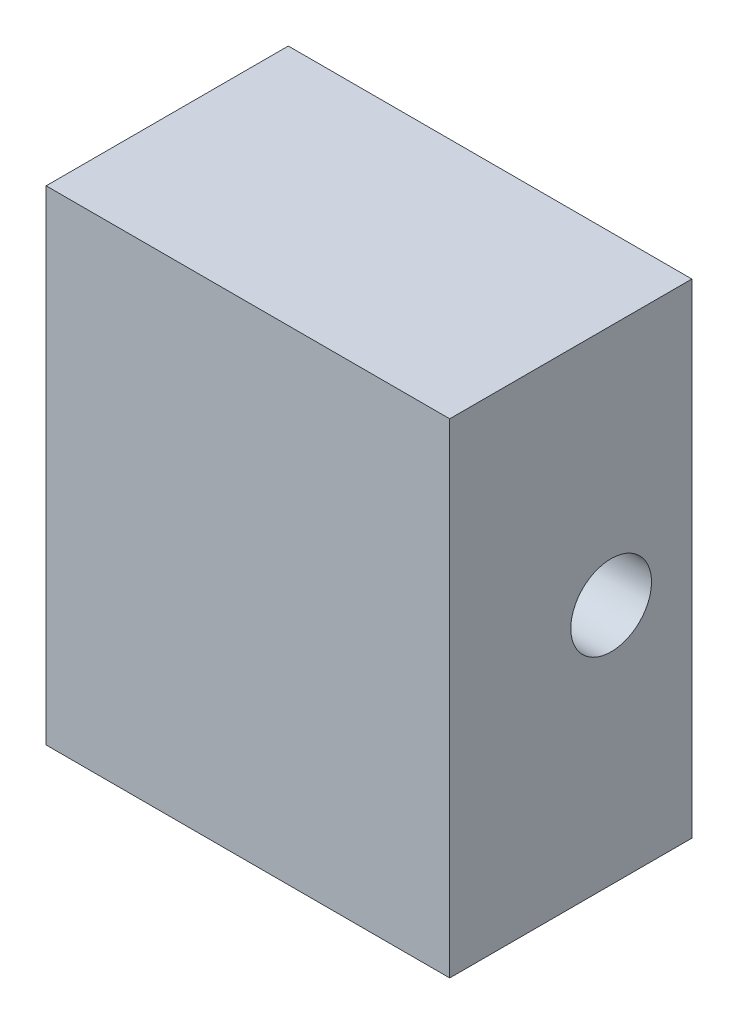
ISO-10303-21;
HEADER;
FILE_DESCRIPTION(('STEP AP214'),'2;1');
FILE_NAME('part.step','',(''),(''),'','','');
FILE_SCHEMA(('AUTOMOTIVE_DESIGN { 1 0 10303 214 1 1 1 1 }'));
ENDSEC;
DATA;
#1=APPLICATION_CONTEXT('core data for automotive mechanical design processes');
#2=APPLICATION_PROTOCOL_DEFINITION('international standard','automotive_design',2000,#1);
#3=PRODUCT_CONTEXT('',#1,'mechanical');
#4=PRODUCT('Part','Part','',(#3));
#5=PRODUCT_RELATED_PRODUCT_CATEGORY('part','',(#4));
#6=PRODUCT_DEFINITION_FORMATION('','',#4);
#7=PRODUCT_DEFINITION_CONTEXT('part definition',#1,'design');
#8=PRODUCT_DEFINITION('design','',#6,#7);
#9=PRODUCT_DEFINITION_SHAPE('','',#8);
#10=(LENGTH_UNIT() NAMED_UNIT(*) SI_UNIT(.MILLI.,.METRE.));
#11=(NAMED_UNIT(*) PLANE_ANGLE_UNIT() SI_UNIT($,.RADIAN.));
#12=(NAMED_UNIT(*) SI_UNIT($,.STERADIAN.) SOLID_ANGLE_UNIT());
#13=UNCERTAINTY_MEASURE_WITH_UNIT(LENGTH_MEASURE(1.E-05),#10,'distance_accuracy_value','');
#14=(GEOMETRIC_REPRESENTATION_CONTEXT(3) GLOBAL_UNCERTAINTY_ASSIGNED_CONTEXT((#13)) GLOBAL_UNIT_ASSIGNED_CONTEXT((#10,
#11,#12)) REPRESENTATION_CONTEXT('',''));
#15=CARTESIAN_POINT('',(0.,0.,0.));
#16=DIRECTION('',(0.,0.,1.));
#17=DIRECTION('',(1.,0.,0.));
#18=AXIS2_PLACEMENT_3D('',#15,#16,#17);
#19=CARTESIAN_POINT('',(-12.5,-15.,15.));
#20=DIRECTION('',(1.,0.,0.));
#21=DIRECTION('',(0.,0.,-1.));
#22=AXIS2_PLACEMENT_3D('',#19,#20,#21);
#23=PLANE('',#22);
#24=CARTESIAN_POINT('',(-12.5,0.,5.));
#25=DIRECTION('',(-1.,0.,0.));
#26=DIRECTION('',(0.,0.,1.));
#27=AXIS2_PLACEMENT_3D('',#24,#25,#26);
#28=CIRCLE('',#27,2.5);
#29=CARTESIAN_POINT('',(-12.5,0.,7.5));
#30=VERTEX_POINT('',#29);
#31=EDGE_CURVE('E115',#30,#30,#28,.T.);
#32=ORIENTED_EDGE('',*,*,#31,.F.);
#33=EDGE_LOOP('',(#32));
#34=FACE_BOUND('',#33,.T.);
#35=DIRECTION('',(0.,-1.,0.));
#36=VECTOR('',#35,1.);
#37=CARTESIAN_POINT('',(-12.5,-15.,0.));
#38=LINE('',#37,#36);
#39=CARTESIAN_POINT('',(-12.5,15.,0.));
#40=VERTEX_POINT('',#39);
#41=CARTESIAN_POINT('',(-12.5,-15.,0.));
#42=VERTEX_POINT('',#41);
#43=EDGE_CURVE('E102',#40,#42,#38,.T.);
#44=ORIENTED_EDGE('',*,*,#43,.T.);
#45=DIRECTION('',(0.,0.,-1.));
#46=VECTOR('',#45,1.);
#47=CARTESIAN_POINT('',(-12.5,-15.,15.));
#48=LINE('',#47,#46);
#49=CARTESIAN_POINT('',(-12.5,-15.,15.));
#50=VERTEX_POINT('',#49);
#51=EDGE_CURVE('E11',#50,#42,#48,.T.);
#52=ORIENTED_EDGE('',*,*,#51,.F.);
#53=DIRECTION('',(0.,-1.,0.));
#54=VECTOR('',#53,1.);
#55=CARTESIAN_POINT('',(-12.5,-15.,15.));
#56=LINE('',#55,#54);
#57=CARTESIAN_POINT('',(-12.5,15.,15.));
#58=VERTEX_POINT('',#57);
#59=EDGE_CURVE('E89',#58,#50,#56,.T.);
#60=ORIENTED_EDGE('',*,*,#59,.F.);
#61=DIRECTION('',(0.,0.,-1.));
#62=VECTOR('',#61,1.);
#63=CARTESIAN_POINT('',(-12.5,15.,15.));
#64=LINE('',#63,#62);
#65=EDGE_CURVE('E98',#58,#40,#64,.T.);
#66=ORIENTED_EDGE('',*,*,#65,.T.);
#67=EDGE_LOOP('',(#44,#52,#60,#66));
#68=FACE_BOUND('',#67,.T.);
#69=ADVANCED_FACE('F37',(#34,#68),#23,.F.);
#70=CARTESIAN_POINT('',(12.5,-15.,15.));
#71=DIRECTION('',(0.,1.,0.));
#72=DIRECTION('',(-1.,0.,0.));
#73=AXIS2_PLACEMENT_3D('',#70,#71,#72);
#74=PLANE('',#73);
#75=DIRECTION('',(1.,0.,0.));
#76=VECTOR('',#75,1.);
#77=CARTESIAN_POINT('',(12.5,-15.,0.));
#78=LINE('',#77,#76);
#79=CARTESIAN_POINT('',(12.5,-15.,0.));
#80=VERTEX_POINT('',#79);
#81=EDGE_CURVE('E93',#42,#80,#78,.T.);
#82=ORIENTED_EDGE('',*,*,#81,.T.);
#83=DIRECTION('',(0.,0.,-1.));
#84=VECTOR('',#83,1.);
#85=CARTESIAN_POINT('',(12.5,-15.,15.));
#86=LINE('',#85,#84);
#87=CARTESIAN_POINT('',(12.5,-15.,15.));
#88=VERTEX_POINT('',#87);
#89=EDGE_CURVE('E46',#88,#80,#86,.T.);
#90=ORIENTED_EDGE('',*,*,#89,.F.);
#91=DIRECTION('',(1.,0.,0.));
#92=VECTOR('',#91,1.);
#93=CARTESIAN_POINT('',(12.5,-15.,15.));
#94=LINE('',#93,#92);
#95=EDGE_CURVE('E84',#50,#88,#94,.T.);
#96=ORIENTED_EDGE('',*,*,#95,.F.);
#97=ORIENTED_EDGE('',*,*,#51,.T.);
#98=EDGE_LOOP('',(#82,#90,#96,#97));
#99=FACE_BOUND('',#98,.T.);
#100=ADVANCED_FACE('F92',(#99),#74,.F.);
#101=CARTESIAN_POINT('',(12.5,-15.,15.));
#102=DIRECTION('',(-1.,0.,0.));
#103=DIRECTION('',(0.,0.,1.));
#104=AXIS2_PLACEMENT_3D('',#101,#102,#103);
#105=PLANE('',#104);
#106=CARTESIAN_POINT('',(12.5,0.,5.));
#107=DIRECTION('',(-1.,0.,0.));
#108=DIRECTION('',(0.,0.,1.));
#109=AXIS2_PLACEMENT_3D('',#106,#107,#108);
#110=CIRCLE('',#109,2.5);
#111=CARTESIAN_POINT('',(12.5,0.,7.5));
#112=VERTEX_POINT('',#111);
#113=EDGE_CURVE('E40',#112,#112,#110,.T.);
#114=ORIENTED_EDGE('',*,*,#113,.T.);
#115=EDGE_LOOP('',(#114));
#116=FACE_BOUND('',#115,.T.);
#117=DIRECTION('',(0.,1.,0.));
#118=VECTOR('',#117,1.);
#119=CARTESIAN_POINT('',(12.5,-15.,0.));
#120=LINE('',#119,#118);
#121=CARTESIAN_POINT('',(12.5,15.,0.));
#122=VERTEX_POINT('',#121);
#123=EDGE_CURVE('E71',#80,#122,#120,.T.);
#124=ORIENTED_EDGE('',*,*,#123,.T.);
#125=DIRECTION('',(0.,0.,-1.));
#126=VECTOR('',#125,1.);
#127=CARTESIAN_POINT('',(12.5,15.,15.));
#128=LINE('',#127,#126);
#129=CARTESIAN_POINT('',(12.5,15.,15.));
#130=VERTEX_POINT('',#129);
#131=EDGE_CURVE('E94',#130,#122,#128,.T.);
#132=ORIENTED_EDGE('',*,*,#131,.F.);
#133=DIRECTION('',(0.,1.,0.));
#134=VECTOR('',#133,1.);
#135=CARTESIAN_POINT('',(12.5,-15.,15.));
#136=LINE('',#135,#134);
#137=EDGE_CURVE('E87',#88,#130,#136,.T.);
#138=ORIENTED_EDGE('',*,*,#137,.F.);
#139=ORIENTED_EDGE('',*,*,#89,.T.);
#140=EDGE_LOOP('',(#124,#132,#138,#139));
#141=FACE_BOUND('',#140,.T.);
#142=ADVANCED_FACE('F96',(#116,#141),#105,.F.);
#143=CARTESIAN_POINT('',(12.5,15.,15.));
#144=DIRECTION('',(0.,-1.,0.));
#145=DIRECTION('',(1.,0.,0.));
#146=AXIS2_PLACEMENT_3D('',#143,#144,#145);
#147=PLANE('',#146);
#148=DIRECTION('',(-1.,0.,0.));
#149=VECTOR('',#148,1.);
#150=CARTESIAN_POINT('',(12.5,15.,0.));
#151=LINE('',#150,#149);
#152=EDGE_CURVE('E77',#122,#40,#151,.T.);
#153=ORIENTED_EDGE('',*,*,#152,.T.);
#154=ORIENTED_EDGE('',*,*,#65,.F.);
#155=DIRECTION('',(-1.,0.,0.));
#156=VECTOR('',#155,1.);
#157=CARTESIAN_POINT('',(12.5,15.,15.));
#158=LINE('',#157,#156);
#159=EDGE_CURVE('E54',#130,#58,#158,.T.);
#160=ORIENTED_EDGE('',*,*,#159,.F.);
#161=ORIENTED_EDGE('',*,*,#131,.T.);
#162=EDGE_LOOP('',(#153,#154,#160,#161));
#163=FACE_BOUND('',#162,.T.);
#164=ADVANCED_FACE('F109',(#163),#147,.F.);
#165=CARTESIAN_POINT('',(0.,0.,15.));
#166=DIRECTION('',(0.,0.,1.));
#167=DIRECTION('',(1.,0.,0.));
#168=AXIS2_PLACEMENT_3D('',#165,#166,#167);
#169=PLANE('',#168);
#170=ORIENTED_EDGE('',*,*,#59,.T.);
#171=ORIENTED_EDGE('',*,*,#95,.T.);
#172=ORIENTED_EDGE('',*,*,#137,.T.);
#173=ORIENTED_EDGE('',*,*,#159,.T.);
#174=EDGE_LOOP('',(#170,#171,#172,#173));
#175=FACE_BOUND('',#174,.T.);
#176=ADVANCED_FACE('F85',(#175),#169,.T.);
#177=CARTESIAN_POINT('',(0.,0.,0.));
#178=DIRECTION('',(0.,0.,1.));
#179=DIRECTION('',(1.,0.,0.));
#180=AXIS2_PLACEMENT_3D('',#177,#178,#179);
#181=PLANE('',#180);
#182=ORIENTED_EDGE('',*,*,#43,.F.);
#183=ORIENTED_EDGE('',*,*,#152,.F.);
#184=ORIENTED_EDGE('',*,*,#123,.F.);
#185=ORIENTED_EDGE('',*,*,#81,.F.);
#186=EDGE_LOOP('',(#182,#183,#184,#185));
#187=FACE_BOUND('',#186,.T.);
#188=ADVANCED_FACE('F112',(#187),#181,.F.);
#189=CARTESIAN_POINT('',(13.5,0.,5.));
#190=DIRECTION('',(-1.,0.,0.));
#191=DIRECTION('',(0.,0.,1.));
#192=AXIS2_PLACEMENT_3D('',#189,#190,#191);
#193=CYLINDRICAL_SURFACE('',#192,2.5);
#194=ORIENTED_EDGE('',*,*,#31,.T.);
#195=EDGE_LOOP('',(#194));
#196=FACE_BOUND('',#195,.T.);
#197=ORIENTED_EDGE('',*,*,#113,.F.);
#198=EDGE_LOOP('',(#197));
#199=FACE_BOUND('',#198,.T.);
#200=ADVANCED_FACE('F123',(#196,#199),#193,.F.);
#201=CLOSED_SHELL('',(#69,#100,#142,#164,#176,#188,#200));
#202=MANIFOLD_SOLID_BREP('B2',#201);
#203=ADVANCED_BREP_SHAPE_REPRESENTATION('',(#18,#202),#14);
#204=SHAPE_DEFINITION_REPRESENTATION(#9,#203);
ENDSEC;
END-ISO-10303-21;
